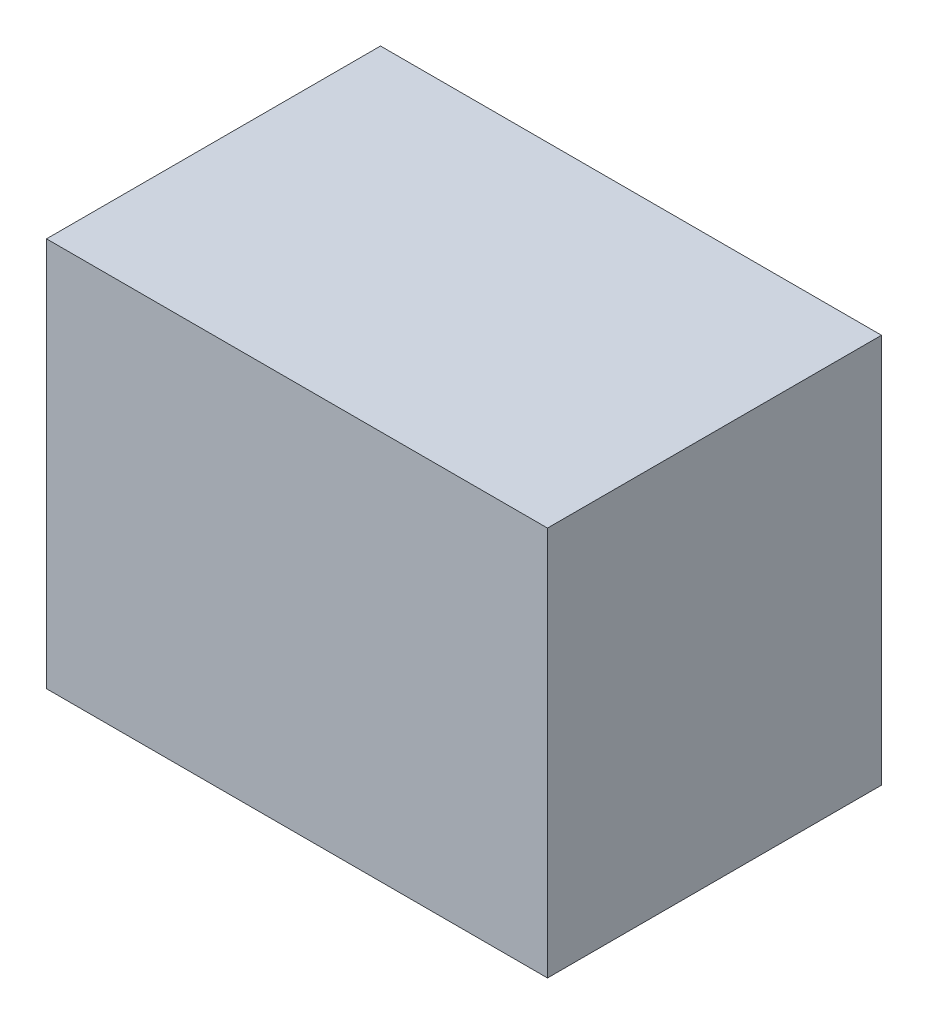
ISO-10303-21;
HEADER;
FILE_DESCRIPTION(('STEP AP214'),'2;1');
FILE_NAME('part.step','',(''),(''),'','','');
FILE_SCHEMA(('AUTOMOTIVE_DESIGN { 1 0 10303 214 1 1 1 1 }'));
ENDSEC;
DATA;
#1=APPLICATION_CONTEXT('core data for automotive mechanical design processes');
#2=APPLICATION_PROTOCOL_DEFINITION('international standard','automotive_design',2000,#1);
#3=PRODUCT_CONTEXT('',#1,'mechanical');
#4=PRODUCT('Part','Part','',(#3));
#5=PRODUCT_RELATED_PRODUCT_CATEGORY('part','',(#4));
#6=PRODUCT_DEFINITION_FORMATION('','',#4);
#7=PRODUCT_DEFINITION_CONTEXT('part definition',#1,'design');
#8=PRODUCT_DEFINITION('design','',#6,#7);
#9=PRODUCT_DEFINITION_SHAPE('','',#8);
#10=(LENGTH_UNIT() NAMED_UNIT(*) SI_UNIT(.MILLI.,.METRE.));
#11=(NAMED_UNIT(*) PLANE_ANGLE_UNIT() SI_UNIT($,.RADIAN.));
#12=(NAMED_UNIT(*) SI_UNIT($,.STERADIAN.) SOLID_ANGLE_UNIT());
#13=UNCERTAINTY_MEASURE_WITH_UNIT(LENGTH_MEASURE(1.E-05),#10,'distance_accuracy_value','');
#14=(GEOMETRIC_REPRESENTATION_CONTEXT(3) GLOBAL_UNCERTAINTY_ASSIGNED_CONTEXT((#13)) GLOBAL_UNIT_ASSIGNED_CONTEXT((#10,
#11,#12)) REPRESENTATION_CONTEXT('',''));
#15=CARTESIAN_POINT('',(0.,0.,0.));
#16=DIRECTION('',(0.,0.,1.));
#17=DIRECTION('',(1.,0.,0.));
#18=AXIS2_PLACEMENT_3D('',#15,#16,#17);
#19=CARTESIAN_POINT('',(45.,-35.,60.));
#20=DIRECTION('',(-1.,0.,0.));
#21=DIRECTION('',(0.,0.,1.));
#22=AXIS2_PLACEMENT_3D('',#19,#20,#21);
#23=PLANE('',#22);
#24=DIRECTION('',(0.,1.,0.));
#25=VECTOR('',#24,1.);
#26=CARTESIAN_POINT('',(45.,-35.,0.));
#27=LINE('',#26,#25);
#28=CARTESIAN_POINT('',(45.,-35.,0.));
#29=VERTEX_POINT('',#28);
#30=CARTESIAN_POINT('',(45.,35.,0.));
#31=VERTEX_POINT('',#30);
#32=EDGE_CURVE('E113',#29,#31,#27,.T.);
#33=ORIENTED_EDGE('',*,*,#32,.T.);
#34=DIRECTION('',(0.,0.,-1.));
#35=VECTOR('',#34,1.);
#36=CARTESIAN_POINT('',(45.,35.,60.));
#37=LINE('',#36,#35);
#38=CARTESIAN_POINT('',(45.,35.,60.));
#39=VERTEX_POINT('',#38);
#40=EDGE_CURVE('E11',#39,#31,#37,.T.);
#41=ORIENTED_EDGE('',*,*,#40,.F.);
#42=DIRECTION('',(0.,1.,0.));
#43=VECTOR('',#42,1.);
#44=CARTESIAN_POINT('',(45.,-35.,60.));
#45=LINE('',#44,#43);
#46=CARTESIAN_POINT('',(45.,-35.,60.));
#47=VERTEX_POINT('',#46);
#48=EDGE_CURVE('E97',#47,#39,#45,.T.);
#49=ORIENTED_EDGE('',*,*,#48,.F.);
#50=DIRECTION('',(0.,0.,-1.));
#51=VECTOR('',#50,1.);
#52=CARTESIAN_POINT('',(45.,-35.,60.));
#53=LINE('',#52,#51);
#54=EDGE_CURVE('E109',#47,#29,#53,.T.);
#55=ORIENTED_EDGE('',*,*,#54,.T.);
#56=EDGE_LOOP('',(#33,#41,#49,#55));
#57=FACE_BOUND('',#56,.T.);
#58=ADVANCED_FACE('F45',(#57),#23,.F.);
#59=CARTESIAN_POINT('',(-45.,35.,60.));
#60=DIRECTION('',(0.,-1.,0.));
#61=DIRECTION('',(0.,0.,-1.));
#62=AXIS2_PLACEMENT_3D('',#59,#60,#61);
#63=PLANE('',#62);
#64=DIRECTION('',(-1.,0.,0.));
#65=VECTOR('',#64,1.);
#66=CARTESIAN_POINT('',(-45.,35.,0.));
#67=LINE('',#66,#65);
#68=CARTESIAN_POINT('',(-45.,35.,0.));
#69=VERTEX_POINT('',#68);
#70=EDGE_CURVE('E102',#31,#69,#67,.T.);
#71=ORIENTED_EDGE('',*,*,#70,.T.);
#72=DIRECTION('',(0.,0.,-1.));
#73=VECTOR('',#72,1.);
#74=CARTESIAN_POINT('',(-45.,35.,60.));
#75=LINE('',#74,#73);
#76=CARTESIAN_POINT('',(-45.,35.,60.));
#77=VERTEX_POINT('',#76);
#78=EDGE_CURVE('E54',#77,#69,#75,.T.);
#79=ORIENTED_EDGE('',*,*,#78,.F.);
#80=DIRECTION('',(-1.,0.,0.));
#81=VECTOR('',#80,1.);
#82=CARTESIAN_POINT('',(-45.,35.,60.));
#83=LINE('',#82,#81);
#84=EDGE_CURVE('E92',#39,#77,#83,.T.);
#85=ORIENTED_EDGE('',*,*,#84,.F.);
#86=ORIENTED_EDGE('',*,*,#40,.T.);
#87=EDGE_LOOP('',(#71,#79,#85,#86));
#88=FACE_BOUND('',#87,.T.);
#89=ADVANCED_FACE('F101',(#88),#63,.F.);
#90=CARTESIAN_POINT('',(-45.,-35.,60.));
#91=DIRECTION('',(1.,0.,0.));
#92=DIRECTION('',(0.,0.,-1.));
#93=AXIS2_PLACEMENT_3D('',#90,#91,#92);
#94=PLANE('',#93);
#95=DIRECTION('',(0.,-1.,0.));
#96=VECTOR('',#95,1.);
#97=CARTESIAN_POINT('',(-45.,-35.,0.));
#98=LINE('',#97,#96);
#99=CARTESIAN_POINT('',(-45.,-35.,0.));
#100=VERTEX_POINT('',#99);
#101=EDGE_CURVE('E79',#69,#100,#98,.T.);
#102=ORIENTED_EDGE('',*,*,#101,.T.);
#103=DIRECTION('',(0.,0.,-1.));
#104=VECTOR('',#103,1.);
#105=CARTESIAN_POINT('',(-45.,-35.,60.));
#106=LINE('',#105,#104);
#107=CARTESIAN_POINT('',(-45.,-35.,60.));
#108=VERTEX_POINT('',#107);
#109=EDGE_CURVE('E104',#108,#100,#106,.T.);
#110=ORIENTED_EDGE('',*,*,#109,.F.);
#111=DIRECTION('',(0.,-1.,0.));
#112=VECTOR('',#111,1.);
#113=CARTESIAN_POINT('',(-45.,-35.,60.));
#114=LINE('',#113,#112);
#115=EDGE_CURVE('E95',#77,#108,#114,.T.);
#116=ORIENTED_EDGE('',*,*,#115,.F.);
#117=ORIENTED_EDGE('',*,*,#78,.T.);
#118=EDGE_LOOP('',(#102,#110,#116,#117));
#119=FACE_BOUND('',#118,.T.);
#120=ADVANCED_FACE('F105',(#119),#94,.F.);
#121=CARTESIAN_POINT('',(-45.,-35.,60.));
#122=DIRECTION('',(0.,1.,0.));
#123=DIRECTION('',(0.,0.,1.));
#124=AXIS2_PLACEMENT_3D('',#121,#122,#123);
#125=PLANE('',#124);
#126=DIRECTION('',(1.,0.,0.));
#127=VECTOR('',#126,1.);
#128=CARTESIAN_POINT('',(-45.,-35.,0.));
#129=LINE('',#128,#127);
#130=EDGE_CURVE('E85',#100,#29,#129,.T.);
#131=ORIENTED_EDGE('',*,*,#130,.T.);
#132=ORIENTED_EDGE('',*,*,#54,.F.);
#133=DIRECTION('',(1.,0.,0.));
#134=VECTOR('',#133,1.);
#135=CARTESIAN_POINT('',(-45.,-35.,60.));
#136=LINE('',#135,#134);
#137=EDGE_CURVE('E62',#108,#47,#136,.T.);
#138=ORIENTED_EDGE('',*,*,#137,.F.);
#139=ORIENTED_EDGE('',*,*,#109,.T.);
#140=EDGE_LOOP('',(#131,#132,#138,#139));
#141=FACE_BOUND('',#140,.T.);
#142=ADVANCED_FACE('F126',(#141),#125,.F.);
#143=CARTESIAN_POINT('',(0.,0.,60.));
#144=DIRECTION('',(0.,0.,-1.));
#145=DIRECTION('',(-1.,0.,0.));
#146=AXIS2_PLACEMENT_3D('',#143,#144,#145);
#147=PLANE('',#146);
#148=ORIENTED_EDGE('',*,*,#48,.T.);
#149=ORIENTED_EDGE('',*,*,#84,.T.);
#150=ORIENTED_EDGE('',*,*,#115,.T.);
#151=ORIENTED_EDGE('',*,*,#137,.T.);
#152=EDGE_LOOP('',(#148,#149,#150,#151));
#153=FACE_BOUND('',#152,.T.);
#154=ADVANCED_FACE('F93',(#153),#147,.F.);
#155=CARTESIAN_POINT('',(0.,0.,0.));
#156=DIRECTION('',(0.,0.,-1.));
#157=DIRECTION('',(-1.,0.,0.));
#158=AXIS2_PLACEMENT_3D('',#155,#156,#157);
#159=PLANE('',#158);
#160=ORIENTED_EDGE('',*,*,#32,.F.);
#161=ORIENTED_EDGE('',*,*,#130,.F.);
#162=ORIENTED_EDGE('',*,*,#101,.F.);
#163=ORIENTED_EDGE('',*,*,#70,.F.);
#164=EDGE_LOOP('',(#160,#161,#162,#163));
#165=FACE_BOUND('',#164,.T.);
#166=ADVANCED_FACE('F129',(#165),#159,.T.);
#167=CLOSED_SHELL('',(#58,#89,#120,#142,#154,#166));
#168=MANIFOLD_SOLID_BREP('B2',#167);
#169=ADVANCED_BREP_SHAPE_REPRESENTATION('',(#18,#168),#14);
#170=SHAPE_DEFINITION_REPRESENTATION(#9,#169);
ENDSEC;
END-ISO-10303-21;
